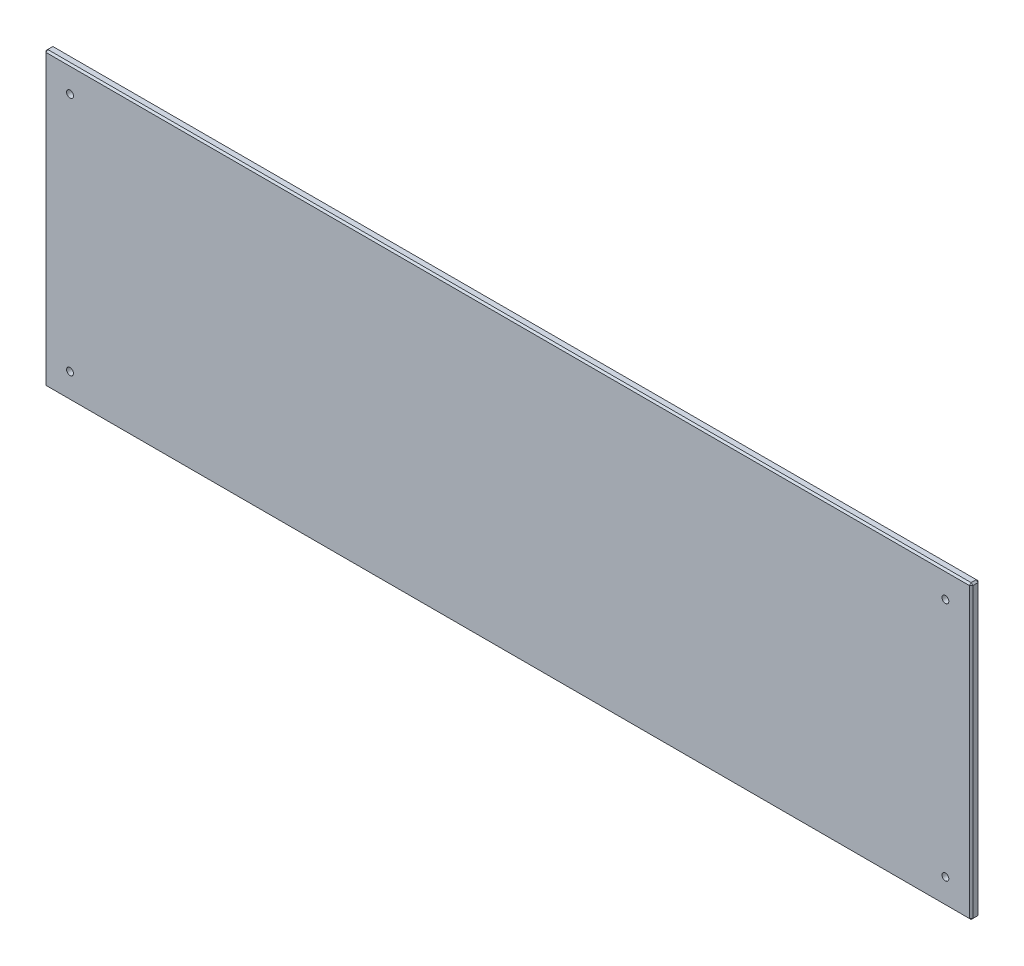
ISO-10303-21;
HEADER;
FILE_DESCRIPTION(('STEP AP214'),'2;1');
FILE_NAME('part.step','',(''),(''),'','','');
FILE_SCHEMA(('AUTOMOTIVE_DESIGN { 1 0 10303 214 1 1 1 1 }'));
ENDSEC;
DATA;
#1=APPLICATION_CONTEXT('core data for automotive mechanical design processes');
#2=APPLICATION_PROTOCOL_DEFINITION('international standard','automotive_design',2000,#1);
#3=PRODUCT_CONTEXT('',#1,'mechanical');
#4=PRODUCT('Part','Part','',(#3));
#5=PRODUCT_RELATED_PRODUCT_CATEGORY('part','',(#4));
#6=PRODUCT_DEFINITION_FORMATION('','',#4);
#7=PRODUCT_DEFINITION_CONTEXT('part definition',#1,'design');
#8=PRODUCT_DEFINITION('design','',#6,#7);
#9=PRODUCT_DEFINITION_SHAPE('','',#8);
#10=(LENGTH_UNIT() NAMED_UNIT(*) SI_UNIT(.MILLI.,.METRE.));
#11=(NAMED_UNIT(*) PLANE_ANGLE_UNIT() SI_UNIT($,.RADIAN.));
#12=(NAMED_UNIT(*) SI_UNIT($,.STERADIAN.) SOLID_ANGLE_UNIT());
#13=UNCERTAINTY_MEASURE_WITH_UNIT(LENGTH_MEASURE(1.E-05),#10,'distance_accuracy_value','');
#14=(GEOMETRIC_REPRESENTATION_CONTEXT(3) GLOBAL_UNCERTAINTY_ASSIGNED_CONTEXT((#13)) GLOBAL_UNIT_ASSIGNED_CONTEXT((#10,
#11,#12)) REPRESENTATION_CONTEXT('',''));
#15=CARTESIAN_POINT('',(0.,0.,0.));
#16=DIRECTION('',(0.,0.,1.));
#17=DIRECTION('',(1.,0.,0.));
#18=AXIS2_PLACEMENT_3D('',#15,#16,#17);
#19=CARTESIAN_POINT('',(0.,0.,5.));
#20=DIRECTION('',(1.,0.,0.));
#21=DIRECTION('',(0.,0.,-1.));
#22=AXIS2_PLACEMENT_3D('',#19,#20,#21);
#23=PLANE('',#22);
#24=DIRECTION('',(0.,0.,-1.));
#25=VECTOR('',#24,1.);
#26=CARTESIAN_POINT('',(0.,169.,5.));
#27=LINE('',#26,#25);
#28=CARTESIAN_POINT('',(0.,169.,4.));
#29=VERTEX_POINT('',#28);
#30=CARTESIAN_POINT('',(0.,169.,0.99999999999989));
#31=VERTEX_POINT('',#30);
#32=EDGE_CURVE('E220',#29,#31,#27,.T.);
#33=ORIENTED_EDGE('',*,*,#32,.T.);
#34=DIRECTION('',(0.,-1.,0.));
#35=VECTOR('',#34,1.);
#36=CARTESIAN_POINT('',(0.,0.,0.99999999999989));
#37=LINE('',#36,#35);
#38=CARTESIAN_POINT('',(0.,1.,0.99999999999989));
#39=VERTEX_POINT('',#38);
#40=EDGE_CURVE('E223',#31,#39,#37,.T.);
#41=ORIENTED_EDGE('',*,*,#40,.T.);
#42=DIRECTION('',(0.,0.,1.));
#43=VECTOR('',#42,1.);
#44=CARTESIAN_POINT('',(0.,1.,5.));
#45=LINE('',#44,#43);
#46=CARTESIAN_POINT('',(0.,1.,4.));
#47=VERTEX_POINT('',#46);
#48=EDGE_CURVE('E214',#39,#47,#45,.T.);
#49=ORIENTED_EDGE('',*,*,#48,.T.);
#50=DIRECTION('',(0.,1.,0.));
#51=VECTOR('',#50,1.);
#52=CARTESIAN_POINT('',(0.,0.,4.));
#53=LINE('',#52,#51);
#54=EDGE_CURVE('E217',#47,#29,#53,.T.);
#55=ORIENTED_EDGE('',*,*,#54,.T.);
#56=EDGE_LOOP('',(#33,#41,#49,#55));
#57=FACE_BOUND('',#56,.T.);
#58=ADVANCED_FACE('F41',(#57),#23,.F.);
#59=CARTESIAN_POINT('',(0.,0.,5.));
#60=DIRECTION('',(0.,1.,0.));
#61=DIRECTION('',(0.,0.,1.));
#62=AXIS2_PLACEMENT_3D('',#59,#60,#61);
#63=PLANE('',#62);
#64=DIRECTION('',(0.,0.,-1.));
#65=VECTOR('',#64,1.);
#66=CARTESIAN_POINT('',(0.99999999999989,0.,5.));
#67=LINE('',#66,#65);
#68=CARTESIAN_POINT('',(0.99999999999989,0.,4.));
#69=VERTEX_POINT('',#68);
#70=CARTESIAN_POINT('',(0.99999999999989,0.,0.99999999999989));
#71=VERTEX_POINT('',#70);
#72=EDGE_CURVE('E169',#69,#71,#67,.T.);
#73=ORIENTED_EDGE('',*,*,#72,.T.);
#74=DIRECTION('',(1.,0.,0.));
#75=VECTOR('',#74,1.);
#76=CARTESIAN_POINT('',(540.,0.,0.99999999999989));
#77=LINE('',#76,#75);
#78=CARTESIAN_POINT('',(539.,0.,0.99999999999989));
#79=VERTEX_POINT('',#78);
#80=EDGE_CURVE('E137',#71,#79,#77,.T.);
#81=ORIENTED_EDGE('',*,*,#80,.T.);
#82=DIRECTION('',(0.,0.,1.));
#83=VECTOR('',#82,1.);
#84=CARTESIAN_POINT('',(539.,0.,5.));
#85=LINE('',#84,#83);
#86=CARTESIAN_POINT('',(539.,0.,4.));
#87=VERTEX_POINT('',#86);
#88=EDGE_CURVE('E158',#79,#87,#85,.T.);
#89=ORIENTED_EDGE('',*,*,#88,.T.);
#90=DIRECTION('',(-1.,0.,0.));
#91=VECTOR('',#90,1.);
#92=CARTESIAN_POINT('',(0.,0.,4.));
#93=LINE('',#92,#91);
#94=EDGE_CURVE('E165',#87,#69,#93,.T.);
#95=ORIENTED_EDGE('',*,*,#94,.T.);
#96=EDGE_LOOP('',(#73,#81,#89,#95));
#97=FACE_BOUND('',#96,.T.);
#98=ADVANCED_FACE('F167',(#97),#63,.F.);
#99=CARTESIAN_POINT('',(540.,0.,5.));
#100=DIRECTION('',(-1.,0.,0.));
#101=DIRECTION('',(0.,0.,1.));
#102=AXIS2_PLACEMENT_3D('',#99,#100,#101);
#103=PLANE('',#102);
#104=DIRECTION('',(0.,0.,-1.));
#105=VECTOR('',#104,1.);
#106=CARTESIAN_POINT('',(540.,1.,5.));
#107=LINE('',#106,#105);
#108=CARTESIAN_POINT('',(540.,1.,4.));
#109=VERTEX_POINT('',#108);
#110=CARTESIAN_POINT('',(540.,1.,1.));
#111=VERTEX_POINT('',#110);
#112=EDGE_CURVE('E194',#109,#111,#107,.T.);
#113=ORIENTED_EDGE('',*,*,#112,.T.);
#114=DIRECTION('',(0.,1.,0.));
#115=VECTOR('',#114,1.);
#116=CARTESIAN_POINT('',(540.,170.,1.));
#117=LINE('',#116,#115);
#118=CARTESIAN_POINT('',(540.,169.,1.));
#119=VERTEX_POINT('',#118);
#120=EDGE_CURVE('E197',#111,#119,#117,.T.);
#121=ORIENTED_EDGE('',*,*,#120,.T.);
#122=DIRECTION('',(0.,0.,1.));
#123=VECTOR('',#122,1.);
#124=CARTESIAN_POINT('',(540.,169.,5.));
#125=LINE('',#124,#123);
#126=CARTESIAN_POINT('',(540.,169.,4.));
#127=VERTEX_POINT('',#126);
#128=EDGE_CURVE('E188',#119,#127,#125,.T.);
#129=ORIENTED_EDGE('',*,*,#128,.T.);
#130=DIRECTION('',(0.,-1.,0.));
#131=VECTOR('',#130,1.);
#132=CARTESIAN_POINT('',(540.,0.,4.));
#133=LINE('',#132,#131);
#134=EDGE_CURVE('E191',#127,#109,#133,.T.);
#135=ORIENTED_EDGE('',*,*,#134,.T.);
#136=EDGE_LOOP('',(#113,#121,#129,#135));
#137=FACE_BOUND('',#136,.T.);
#138=ADVANCED_FACE('F348',(#137),#103,.F.);
#139=CARTESIAN_POINT('',(0.,170.,5.));
#140=DIRECTION('',(0.,-1.,0.));
#141=DIRECTION('',(0.,0.,-1.));
#142=AXIS2_PLACEMENT_3D('',#139,#140,#141);
#143=PLANE('',#142);
#144=DIRECTION('',(-1.,0.,0.));
#145=VECTOR('',#144,1.);
#146=CARTESIAN_POINT('',(0.,170.,0.99999999999989));
#147=LINE('',#146,#145);
#148=CARTESIAN_POINT('',(539.,170.,0.99999999999989));
#149=VERTEX_POINT('',#148);
#150=CARTESIAN_POINT('',(0.99999999999989,170.,0.99999999999989));
#151=VERTEX_POINT('',#150);
#152=EDGE_CURVE('E207',#149,#151,#147,.T.);
#153=ORIENTED_EDGE('',*,*,#152,.T.);
#154=DIRECTION('',(0.,0.,1.));
#155=VECTOR('',#154,1.);
#156=CARTESIAN_POINT('',(0.99999999999989,170.,5.));
#157=LINE('',#156,#155);
#158=CARTESIAN_POINT('',(0.99999999999989,170.,4.00000000000011));
#159=VERTEX_POINT('',#158);
#160=EDGE_CURVE('E211',#151,#159,#157,.T.);
#161=ORIENTED_EDGE('',*,*,#160,.T.);
#162=DIRECTION('',(1.,0.,0.));
#163=VECTOR('',#162,1.);
#164=CARTESIAN_POINT('',(0.,170.,4.00000000000011));
#165=LINE('',#164,#163);
#166=CARTESIAN_POINT('',(539.,170.,4.00000000000011));
#167=VERTEX_POINT('',#166);
#168=EDGE_CURVE('E204',#159,#167,#165,.T.);
#169=ORIENTED_EDGE('',*,*,#168,.T.);
#170=DIRECTION('',(0.,0.,-1.));
#171=VECTOR('',#170,1.);
#172=CARTESIAN_POINT('',(539.,170.,5.));
#173=LINE('',#172,#171);
#174=EDGE_CURVE('E201',#167,#149,#173,.T.);
#175=ORIENTED_EDGE('',*,*,#174,.T.);
#176=EDGE_LOOP('',(#153,#161,#169,#175));
#177=FACE_BOUND('',#176,.T.);
#178=ADVANCED_FACE('F475',(#177),#143,.F.);
#179=CARTESIAN_POINT('',(0.,0.,5.));
#180=DIRECTION('',(0.,0.,-1.));
#181=DIRECTION('',(-1.,0.,0.));
#182=AXIS2_PLACEMENT_3D('',#179,#180,#181);
#183=PLANE('',#182);
#184=CARTESIAN_POINT('',(525.,15.,5.));
#185=DIRECTION('',(0.,0.,1.));
#186=DIRECTION('',(1.,0.,0.));
#187=AXIS2_PLACEMENT_3D('',#184,#185,#186);
#188=CIRCLE('',#187,2.);
#189=CARTESIAN_POINT('',(527.,15.,5.));
#190=VERTEX_POINT('',#189);
#191=EDGE_CURVE('E520',#190,#190,#188,.T.);
#192=ORIENTED_EDGE('',*,*,#191,.F.);
#193=EDGE_LOOP('',(#192));
#194=FACE_BOUND('',#193,.T.);
#195=CARTESIAN_POINT('',(15.,155.,5.));
#196=DIRECTION('',(0.,0.,1.));
#197=DIRECTION('',(1.,0.,0.));
#198=AXIS2_PLACEMENT_3D('',#195,#196,#197);
#199=CIRCLE('',#198,2.00000000000001);
#200=CARTESIAN_POINT('',(17.,155.,5.));
#201=VERTEX_POINT('',#200);
#202=EDGE_CURVE('E511',#201,#201,#199,.T.);
#203=ORIENTED_EDGE('',*,*,#202,.F.);
#204=EDGE_LOOP('',(#203));
#205=FACE_BOUND('',#204,.T.);
#206=CARTESIAN_POINT('',(15.,15.,5.));
#207=DIRECTION('',(0.,0.,1.));
#208=DIRECTION('',(1.,0.,0.));
#209=AXIS2_PLACEMENT_3D('',#206,#207,#208);
#210=CIRCLE('',#209,2.00000000000001);
#211=CARTESIAN_POINT('',(17.,15.,5.));
#212=VERTEX_POINT('',#211);
#213=EDGE_CURVE('E526',#212,#212,#210,.T.);
#214=ORIENTED_EDGE('',*,*,#213,.F.);
#215=EDGE_LOOP('',(#214));
#216=FACE_BOUND('',#215,.T.);
#217=CARTESIAN_POINT('',(525.,155.,5.));
#218=DIRECTION('',(0.,0.,1.));
#219=DIRECTION('',(1.,0.,0.));
#220=AXIS2_PLACEMENT_3D('',#217,#218,#219);
#221=CIRCLE('',#220,2.);
#222=CARTESIAN_POINT('',(527.,155.,5.));
#223=VERTEX_POINT('',#222);
#224=EDGE_CURVE('E503',#223,#223,#221,.T.);
#225=ORIENTED_EDGE('',*,*,#224,.F.);
#226=EDGE_LOOP('',(#225));
#227=FACE_BOUND('',#226,.T.);
#228=DIRECTION('',(0.,1.,0.));
#229=VECTOR('',#228,1.);
#230=CARTESIAN_POINT('',(539.,0.,5.));
#231=LINE('',#230,#229);
#232=CARTESIAN_POINT('',(539.,0.99999999999989,5.));
#233=VERTEX_POINT('',#232);
#234=CARTESIAN_POINT('',(539.,169.,5.));
#235=VERTEX_POINT('',#234);
#236=EDGE_CURVE('E227',#233,#235,#231,.T.);
#237=ORIENTED_EDGE('',*,*,#236,.T.);
#238=DIRECTION('',(-1.,0.,0.));
#239=VECTOR('',#238,1.);
#240=CARTESIAN_POINT('',(0.,169.,5.));
#241=LINE('',#240,#239);
#242=CARTESIAN_POINT('',(0.99999999999989,169.,5.));
#243=VERTEX_POINT('',#242);
#244=EDGE_CURVE('E11',#235,#243,#241,.T.);
#245=ORIENTED_EDGE('',*,*,#244,.T.);
#246=DIRECTION('',(0.,-1.,0.));
#247=VECTOR('',#246,1.);
#248=CARTESIAN_POINT('',(0.99999999999989,0.,5.));
#249=LINE('',#248,#247);
#250=CARTESIAN_POINT('',(0.99999999999989,0.99999999999989,5.));
#251=VERTEX_POINT('',#250);
#252=EDGE_CURVE('E52',#243,#251,#249,.T.);
#253=ORIENTED_EDGE('',*,*,#252,.T.);
#254=DIRECTION('',(1.,0.,0.));
#255=VECTOR('',#254,1.);
#256=CARTESIAN_POINT('',(0.,0.99999999999989,5.));
#257=LINE('',#256,#255);
#258=EDGE_CURVE('E230',#251,#233,#257,.T.);
#259=ORIENTED_EDGE('',*,*,#258,.T.);
#260=EDGE_LOOP('',(#237,#245,#253,#259));
#261=FACE_BOUND('',#260,.T.);
#262=ADVANCED_FACE('F469',(#194,#205,#216,#227,#261),#183,.F.);
#263=CARTESIAN_POINT('',(0.,0.,0.));
#264=DIRECTION('',(0.,0.,-1.));
#265=DIRECTION('',(-1.,0.,0.));
#266=AXIS2_PLACEMENT_3D('',#263,#264,#265);
#267=PLANE('',#266);
#268=CARTESIAN_POINT('',(525.,15.,0.));
#269=DIRECTION('',(0.,0.,1.));
#270=DIRECTION('',(1.,0.,0.));
#271=AXIS2_PLACEMENT_3D('',#268,#269,#270);
#272=CIRCLE('',#271,2.);
#273=CARTESIAN_POINT('',(527.,15.,0.));
#274=VERTEX_POINT('',#273);
#275=EDGE_CURVE('E507',#274,#274,#272,.T.);
#276=ORIENTED_EDGE('',*,*,#275,.T.);
#277=EDGE_LOOP('',(#276));
#278=FACE_BOUND('',#277,.T.);
#279=CARTESIAN_POINT('',(15.,155.,0.));
#280=DIRECTION('',(0.,0.,1.));
#281=DIRECTION('',(1.,0.,0.));
#282=AXIS2_PLACEMENT_3D('',#279,#280,#281);
#283=CIRCLE('',#282,2.00000000000001);
#284=CARTESIAN_POINT('',(17.,155.,0.));
#285=VERTEX_POINT('',#284);
#286=EDGE_CURVE('E515',#285,#285,#283,.T.);
#287=ORIENTED_EDGE('',*,*,#286,.T.);
#288=EDGE_LOOP('',(#287));
#289=FACE_BOUND('',#288,.T.);
#290=CARTESIAN_POINT('',(15.,15.,0.));
#291=DIRECTION('',(0.,0.,1.));
#292=DIRECTION('',(1.,0.,0.));
#293=AXIS2_PLACEMENT_3D('',#290,#291,#292);
#294=CIRCLE('',#293,2.00000000000001);
#295=CARTESIAN_POINT('',(17.,15.,0.));
#296=VERTEX_POINT('',#295);
#297=EDGE_CURVE('E516',#296,#296,#294,.T.);
#298=ORIENTED_EDGE('',*,*,#297,.T.);
#299=EDGE_LOOP('',(#298));
#300=FACE_BOUND('',#299,.T.);
#301=CARTESIAN_POINT('',(525.,155.,0.));
#302=DIRECTION('',(0.,0.,1.));
#303=DIRECTION('',(1.,0.,0.));
#304=AXIS2_PLACEMENT_3D('',#301,#302,#303);
#305=CIRCLE('',#304,2.);
#306=CARTESIAN_POINT('',(527.,155.,0.));
#307=VERTEX_POINT('',#306);
#308=EDGE_CURVE('E144',#307,#307,#305,.T.);
#309=ORIENTED_EDGE('',*,*,#308,.T.);
#310=EDGE_LOOP('',(#309));
#311=FACE_BOUND('',#310,.T.);
#312=DIRECTION('',(0.,-1.,0.));
#313=VECTOR('',#312,1.);
#314=CARTESIAN_POINT('',(539.,0.,0.));
#315=LINE('',#314,#313);
#316=CARTESIAN_POINT('',(539.,169.,0.));
#317=VERTEX_POINT('',#316);
#318=CARTESIAN_POINT('',(539.,1.,0.));
#319=VERTEX_POINT('',#318);
#320=EDGE_CURVE('E183',#317,#319,#315,.T.);
#321=ORIENTED_EDGE('',*,*,#320,.T.);
#322=DIRECTION('',(-1.,0.,0.));
#323=VECTOR('',#322,1.);
#324=CARTESIAN_POINT('',(0.,1.,0.));
#325=LINE('',#324,#323);
#326=CARTESIAN_POINT('',(1.,1.,0.));
#327=VERTEX_POINT('',#326);
#328=EDGE_CURVE('E139',#319,#327,#325,.T.);
#329=ORIENTED_EDGE('',*,*,#328,.T.);
#330=DIRECTION('',(0.,1.,0.));
#331=VECTOR('',#330,1.);
#332=CARTESIAN_POINT('',(1.,170.,0.));
#333=LINE('',#332,#331);
#334=CARTESIAN_POINT('',(1.,169.,0.));
#335=VERTEX_POINT('',#334);
#336=EDGE_CURVE('E172',#327,#335,#333,.T.);
#337=ORIENTED_EDGE('',*,*,#336,.T.);
#338=DIRECTION('',(1.,0.,0.));
#339=VECTOR('',#338,1.);
#340=CARTESIAN_POINT('',(540.,169.,0.));
#341=LINE('',#340,#339);
#342=EDGE_CURVE('E176',#335,#317,#341,.T.);
#343=ORIENTED_EDGE('',*,*,#342,.T.);
#344=EDGE_LOOP('',(#321,#329,#337,#343));
#345=FACE_BOUND('',#344,.T.);
#346=ADVANCED_FACE('F465',(#278,#289,#300,#311,#345),#267,.T.);
#347=CARTESIAN_POINT('',(0.,169.,5.));
#348=DIRECTION('',(0.,-0.707106781186508,-0.707106781186587));
#349=DIRECTION('',(-1.,0.,0.));
#350=AXIS2_PLACEMENT_3D('',#347,#348,#349);
#351=PLANE('',#350);
#352=DIRECTION('',(0.,-0.707106781186587,0.707106781186508));
#353=VECTOR('',#352,1.);
#354=CARTESIAN_POINT('',(0.99999999999989,169.,5.));
#355=LINE('',#354,#353);
#356=EDGE_CURVE('E46',#243,#159,#355,.F.);
#357=ORIENTED_EDGE('',*,*,#356,.F.);
#358=ORIENTED_EDGE('',*,*,#244,.F.);
#359=DIRECTION('',(0.,0.707106781186587,-0.707106781186508));
#360=VECTOR('',#359,1.);
#361=CARTESIAN_POINT('',(539.,170.,4.00000000000011));
#362=LINE('',#361,#360);
#363=EDGE_CURVE('E303',#167,#235,#362,.F.);
#364=ORIENTED_EDGE('',*,*,#363,.F.);
#365=ORIENTED_EDGE('',*,*,#168,.F.);
#366=EDGE_LOOP('',(#357,#358,#364,#365));
#367=FACE_BOUND('',#366,.T.);
#368=ADVANCED_FACE('F44',(#367),#351,.F.);
#369=CARTESIAN_POINT('',(0.99999999999989,169.,5.));
#370=DIRECTION('',(-0.57735026918969,0.577350269189562,0.577350269189626));
#371=DIRECTION('',(0.707106781186508,0.,0.707106781186587));
#372=AXIS2_PLACEMENT_3D('',#369,#370,#371);
#373=PLANE('',#372);
#374=DIRECTION('',(-0.707106781186508,0.,-0.707106781186587));
#375=VECTOR('',#374,1.);
#376=CARTESIAN_POINT('',(0.99999999999989,169.,5.));
#377=LINE('',#376,#375);
#378=EDGE_CURVE('E297',#243,#29,#377,.T.);
#379=ORIENTED_EDGE('',*,*,#378,.F.);
#380=ORIENTED_EDGE('',*,*,#356,.T.);
#381=DIRECTION('',(0.707106781186508,0.707106781186587,0.));
#382=VECTOR('',#381,1.);
#383=CARTESIAN_POINT('',(0.499999999999945,169.5,4.00000000000006));
#384=LINE('',#383,#382);
#385=EDGE_CURVE('E300',#29,#159,#384,.T.);
#386=ORIENTED_EDGE('',*,*,#385,.F.);
#387=EDGE_LOOP('',(#379,#380,#386));
#388=FACE_BOUND('',#387,.T.);
#389=ADVANCED_FACE('F315',(#388),#373,.T.);
#390=CARTESIAN_POINT('',(539.,170.,4.00000000000011));
#391=DIRECTION('',(0.57735026918969,0.577350269189562,0.577350269189626));
#392=DIRECTION('',(0.707106781186508,0.,-0.707106781186587));
#393=AXIS2_PLACEMENT_3D('',#390,#391,#392);
#394=PLANE('',#393);
#395=DIRECTION('',(0.707106781186508,-0.707106781186587,0.));
#396=VECTOR('',#395,1.);
#397=CARTESIAN_POINT('',(539.,170.,4.00000000000011));
#398=LINE('',#397,#396);
#399=EDGE_CURVE('E289',#167,#127,#398,.T.);
#400=ORIENTED_EDGE('',*,*,#399,.F.);
#401=ORIENTED_EDGE('',*,*,#363,.T.);
#402=DIRECTION('',(-0.707106781186508,0.,0.707106781186587));
#403=VECTOR('',#402,1.);
#404=CARTESIAN_POINT('',(539.5,169.,4.5));
#405=LINE('',#404,#403);
#406=EDGE_CURVE('E293',#127,#235,#405,.T.);
#407=ORIENTED_EDGE('',*,*,#406,.F.);
#408=EDGE_LOOP('',(#400,#401,#407));
#409=FACE_BOUND('',#408,.T.);
#410=ADVANCED_FACE('F340',(#409),#394,.T.);
#411=CARTESIAN_POINT('',(0.,169.,5.));
#412=DIRECTION('',(0.707106781186587,-0.707106781186508,0.));
#413=DIRECTION('',(0.,0.,-1.));
#414=AXIS2_PLACEMENT_3D('',#411,#412,#413);
#415=PLANE('',#414);
#416=ORIENTED_EDGE('',*,*,#385,.T.);
#417=ORIENTED_EDGE('',*,*,#160,.F.);
#418=DIRECTION('',(-0.707106781186508,-0.707106781186587,0.));
#419=VECTOR('',#418,1.);
#420=CARTESIAN_POINT('',(0.99999999999989,170.,0.99999999999989));
#421=LINE('',#420,#419);
#422=EDGE_CURVE('E282',#31,#151,#421,.F.);
#423=ORIENTED_EDGE('',*,*,#422,.F.);
#424=ORIENTED_EDGE('',*,*,#32,.F.);
#425=EDGE_LOOP('',(#416,#417,#423,#424));
#426=FACE_BOUND('',#425,.T.);
#427=ADVANCED_FACE('F322',(#426),#415,.F.);
#428=CARTESIAN_POINT('',(0.99999999999989,0.,5.));
#429=DIRECTION('',(0.707106781186587,0.,-0.707106781186508));
#430=DIRECTION('',(0.,-1.,0.));
#431=AXIS2_PLACEMENT_3D('',#428,#429,#430);
#432=PLANE('',#431);
#433=ORIENTED_EDGE('',*,*,#378,.T.);
#434=ORIENTED_EDGE('',*,*,#54,.F.);
#435=DIRECTION('',(0.707106781186508,0.,0.707106781186587));
#436=VECTOR('',#435,1.);
#437=CARTESIAN_POINT('',(0.99999999999989,0.99999999999989,5.));
#438=LINE('',#437,#436);
#439=EDGE_CURVE('E278',#251,#47,#438,.F.);
#440=ORIENTED_EDGE('',*,*,#439,.F.);
#441=ORIENTED_EDGE('',*,*,#252,.F.);
#442=EDGE_LOOP('',(#433,#434,#440,#441));
#443=FACE_BOUND('',#442,.T.);
#444=ADVANCED_FACE('F329',(#443),#432,.F.);
#445=CARTESIAN_POINT('',(0.,0.99999999999989,5.));
#446=DIRECTION('',(0.,0.707106781186587,-0.707106781186508));
#447=DIRECTION('',(1.,0.,0.));
#448=AXIS2_PLACEMENT_3D('',#445,#446,#447);
#449=PLANE('',#448);
#450=DIRECTION('',(0.,0.707106781186508,0.707106781186587));
#451=VECTOR('',#450,1.);
#452=CARTESIAN_POINT('',(539.,0.99999999999989,5.));
#453=LINE('',#452,#451);
#454=EDGE_CURVE('E270',#233,#87,#453,.F.);
#455=ORIENTED_EDGE('',*,*,#454,.F.);
#456=ORIENTED_EDGE('',*,*,#258,.F.);
#457=DIRECTION('',(0.,-0.707106781186508,-0.707106781186587));
#458=VECTOR('',#457,1.);
#459=CARTESIAN_POINT('',(0.99999999999989,0.99999999999989,5.));
#460=LINE('',#459,#458);
#461=EDGE_CURVE('E274',#69,#251,#460,.F.);
#462=ORIENTED_EDGE('',*,*,#461,.F.);
#463=ORIENTED_EDGE('',*,*,#94,.F.);
#464=EDGE_LOOP('',(#455,#456,#462,#463));
#465=FACE_BOUND('',#464,.T.);
#466=ADVANCED_FACE('F331',(#465),#449,.F.);
#467=CARTESIAN_POINT('',(539.,0.,5.));
#468=DIRECTION('',(-0.707106781186587,0.,-0.707106781186508));
#469=DIRECTION('',(0.,1.,0.));
#470=AXIS2_PLACEMENT_3D('',#467,#468,#469);
#471=PLANE('',#470);
#472=ORIENTED_EDGE('',*,*,#406,.T.);
#473=ORIENTED_EDGE('',*,*,#236,.F.);
#474=DIRECTION('',(0.707106781186508,0.,-0.707106781186587));
#475=VECTOR('',#474,1.);
#476=CARTESIAN_POINT('',(539.,0.99999999999989,5.));
#477=LINE('',#476,#475);
#478=EDGE_CURVE('E266',#109,#233,#477,.F.);
#479=ORIENTED_EDGE('',*,*,#478,.F.);
#480=ORIENTED_EDGE('',*,*,#134,.F.);
#481=EDGE_LOOP('',(#472,#473,#479,#480));
#482=FACE_BOUND('',#481,.T.);
#483=ADVANCED_FACE('F337',(#482),#471,.F.);
#484=CARTESIAN_POINT('',(539.,170.,5.));
#485=DIRECTION('',(-0.707106781186587,-0.707106781186508,0.));
#486=DIRECTION('',(0.,0.,-1.));
#487=AXIS2_PLACEMENT_3D('',#484,#485,#486);
#488=PLANE('',#487);
#489=ORIENTED_EDGE('',*,*,#399,.T.);
#490=ORIENTED_EDGE('',*,*,#128,.F.);
#491=DIRECTION('',(-0.707106781186508,0.707106781186587,0.));
#492=VECTOR('',#491,1.);
#493=CARTESIAN_POINT('',(540.,169.,1.));
#494=LINE('',#493,#492);
#495=EDGE_CURVE('E262',#149,#119,#494,.F.);
#496=ORIENTED_EDGE('',*,*,#495,.F.);
#497=ORIENTED_EDGE('',*,*,#174,.F.);
#498=EDGE_LOOP('',(#489,#490,#496,#497));
#499=FACE_BOUND('',#498,.T.);
#500=ADVANCED_FACE('F431',(#499),#488,.F.);
#501=CARTESIAN_POINT('',(0.,170.,0.99999999999989));
#502=DIRECTION('',(0.,0.707106781186508,-0.707106781186587));
#503=DIRECTION('',(1.,0.,0.));
#504=AXIS2_PLACEMENT_3D('',#501,#502,#503);
#505=PLANE('',#504);
#506=DIRECTION('',(0.,-0.707106781186587,-0.707106781186508));
#507=VECTOR('',#506,1.);
#508=CARTESIAN_POINT('',(0.99999999999989,170.,0.99999999999989));
#509=LINE('',#508,#507);
#510=EDGE_CURVE('E285',#151,#335,#509,.T.);
#511=ORIENTED_EDGE('',*,*,#510,.F.);
#512=ORIENTED_EDGE('',*,*,#152,.F.);
#513=DIRECTION('',(0.,0.707106781186587,0.707106781186508));
#514=VECTOR('',#513,1.);
#515=CARTESIAN_POINT('',(539.,169.5,0.499999999999945));
#516=LINE('',#515,#514);
#517=EDGE_CURVE('E258',#317,#149,#516,.T.);
#518=ORIENTED_EDGE('',*,*,#517,.F.);
#519=ORIENTED_EDGE('',*,*,#342,.F.);
#520=EDGE_LOOP('',(#511,#512,#518,#519));
#521=FACE_BOUND('',#520,.T.);
#522=ADVANCED_FACE('F424',(#521),#505,.T.);
#523=CARTESIAN_POINT('',(0.99999999999989,170.,0.99999999999989));
#524=DIRECTION('',(-0.577350269189626,0.577350269189562,-0.57735026918969));
#525=DIRECTION('',(-0.707106781186587,0.,0.707106781186508));
#526=AXIS2_PLACEMENT_3D('',#523,#524,#525);
#527=PLANE('',#526);
#528=ORIENTED_EDGE('',*,*,#422,.T.);
#529=ORIENTED_EDGE('',*,*,#510,.T.);
#530=DIRECTION('',(-0.707106781186587,0.,0.707106781186508));
#531=VECTOR('',#530,1.);
#532=CARTESIAN_POINT('',(0.5,169.,0.499999999999945));
#533=LINE('',#532,#531);
#534=EDGE_CURVE('E254',#31,#335,#533,.F.);
#535=ORIENTED_EDGE('',*,*,#534,.F.);
#536=EDGE_LOOP('',(#528,#529,#535));
#537=FACE_BOUND('',#536,.T.);
#538=ADVANCED_FACE('F417',(#537),#527,.T.);
#539=CARTESIAN_POINT('',(0.99999999999989,0.99999999999989,5.));
#540=DIRECTION('',(-0.57735026918969,-0.577350269189626,0.577350269189562));
#541=DIRECTION('',(0.707106781186508,-0.707106781186587,0.));
#542=AXIS2_PLACEMENT_3D('',#539,#540,#541);
#543=PLANE('',#542);
#544=ORIENTED_EDGE('',*,*,#461,.T.);
#545=ORIENTED_EDGE('',*,*,#439,.T.);
#546=DIRECTION('',(-0.707106781186508,0.707106781186587,0.));
#547=VECTOR('',#546,1.);
#548=CARTESIAN_POINT('',(0.499999999999945,0.5,4.));
#549=LINE('',#548,#547);
#550=EDGE_CURVE('E250',#69,#47,#549,.T.);
#551=ORIENTED_EDGE('',*,*,#550,.F.);
#552=EDGE_LOOP('',(#544,#545,#551));
#553=FACE_BOUND('',#552,.T.);
#554=ADVANCED_FACE('F410',(#553),#543,.T.);
#555=CARTESIAN_POINT('',(539.,0.99999999999989,5.));
#556=DIRECTION('',(0.57735026918969,-0.577350269189626,0.577350269189562));
#557=DIRECTION('',(0.707106781186508,0.707106781186587,0.));
#558=AXIS2_PLACEMENT_3D('',#555,#556,#557);
#559=PLANE('',#558);
#560=ORIENTED_EDGE('',*,*,#478,.T.);
#561=ORIENTED_EDGE('',*,*,#454,.T.);
#562=DIRECTION('',(-0.707106781186508,-0.707106781186587,0.));
#563=VECTOR('',#562,1.);
#564=CARTESIAN_POINT('',(539.5,0.500000000000001,4.));
#565=LINE('',#564,#563);
#566=EDGE_CURVE('E161',#109,#87,#565,.T.);
#567=ORIENTED_EDGE('',*,*,#566,.F.);
#568=EDGE_LOOP('',(#560,#561,#567));
#569=FACE_BOUND('',#568,.T.);
#570=ADVANCED_FACE('F403',(#569),#559,.T.);
#571=CARTESIAN_POINT('',(540.,169.,1.));
#572=DIRECTION('',(0.57735026918969,0.577350269189562,-0.577350269189626));
#573=DIRECTION('',(-0.707106781186508,0.,-0.707106781186587));
#574=AXIS2_PLACEMENT_3D('',#571,#572,#573);
#575=PLANE('',#574);
#576=ORIENTED_EDGE('',*,*,#517,.T.);
#577=ORIENTED_EDGE('',*,*,#495,.T.);
#578=DIRECTION('',(-0.707106781186508,0.,-0.707106781186587));
#579=VECTOR('',#578,1.);
#580=CARTESIAN_POINT('',(540.,169.,1.));
#581=LINE('',#580,#579);
#582=EDGE_CURVE('E245',#317,#119,#581,.F.);
#583=ORIENTED_EDGE('',*,*,#582,.F.);
#584=EDGE_LOOP('',(#576,#577,#583));
#585=FACE_BOUND('',#584,.T.);
#586=ADVANCED_FACE('F396',(#585),#575,.T.);
#587=CARTESIAN_POINT('',(0.,0.,0.99999999999989));
#588=DIRECTION('',(-0.707106781186508,0.,-0.707106781186587));
#589=DIRECTION('',(0.,1.,0.));
#590=AXIS2_PLACEMENT_3D('',#587,#588,#589);
#591=PLANE('',#590);
#592=ORIENTED_EDGE('',*,*,#534,.T.);
#593=ORIENTED_EDGE('',*,*,#336,.F.);
#594=DIRECTION('',(0.707106781186587,0.,-0.707106781186508));
#595=VECTOR('',#594,1.);
#596=CARTESIAN_POINT('',(1.,1.,0.));
#597=LINE('',#596,#595);
#598=EDGE_CURVE('E241',#39,#327,#597,.T.);
#599=ORIENTED_EDGE('',*,*,#598,.F.);
#600=ORIENTED_EDGE('',*,*,#40,.F.);
#601=EDGE_LOOP('',(#592,#593,#599,#600));
#602=FACE_BOUND('',#601,.T.);
#603=ADVANCED_FACE('F389',(#602),#591,.T.);
#604=CARTESIAN_POINT('',(0.99999999999989,0.,5.));
#605=DIRECTION('',(0.707106781186587,0.707106781186508,0.));
#606=DIRECTION('',(0.,0.,-1.));
#607=AXIS2_PLACEMENT_3D('',#604,#605,#606);
#608=PLANE('',#607);
#609=ORIENTED_EDGE('',*,*,#550,.T.);
#610=ORIENTED_EDGE('',*,*,#48,.F.);
#611=DIRECTION('',(0.707106781186508,-0.707106781186587,0.));
#612=VECTOR('',#611,1.);
#613=CARTESIAN_POINT('',(0.499999999999945,0.500000000000001,0.99999999999989));
#614=LINE('',#613,#612);
#615=EDGE_CURVE('E155',#71,#39,#614,.F.);
#616=ORIENTED_EDGE('',*,*,#615,.F.);
#617=ORIENTED_EDGE('',*,*,#72,.F.);
#618=EDGE_LOOP('',(#609,#610,#616,#617));
#619=FACE_BOUND('',#618,.T.);
#620=ADVANCED_FACE('F383',(#619),#608,.F.);
#621=CARTESIAN_POINT('',(540.,1.,5.));
#622=DIRECTION('',(-0.707106781186587,0.707106781186508,0.));
#623=DIRECTION('',(0.,0.,-1.));
#624=AXIS2_PLACEMENT_3D('',#621,#622,#623);
#625=PLANE('',#624);
#626=ORIENTED_EDGE('',*,*,#566,.T.);
#627=ORIENTED_EDGE('',*,*,#88,.F.);
#628=DIRECTION('',(0.707106781186508,0.707106781186587,0.));
#629=VECTOR('',#628,1.);
#630=CARTESIAN_POINT('',(539.,0.,0.99999999999989));
#631=LINE('',#630,#629);
#632=EDGE_CURVE('E147',#111,#79,#631,.F.);
#633=ORIENTED_EDGE('',*,*,#632,.F.);
#634=ORIENTED_EDGE('',*,*,#112,.F.);
#635=EDGE_LOOP('',(#626,#627,#633,#634));
#636=FACE_BOUND('',#635,.T.);
#637=ADVANCED_FACE('F159',(#636),#625,.F.);
#638=CARTESIAN_POINT('',(540.,0.,1.));
#639=DIRECTION('',(0.707106781186587,0.,-0.707106781186508));
#640=DIRECTION('',(0.,-1.,0.));
#641=AXIS2_PLACEMENT_3D('',#638,#639,#640);
#642=PLANE('',#641);
#643=ORIENTED_EDGE('',*,*,#582,.T.);
#644=ORIENTED_EDGE('',*,*,#120,.F.);
#645=DIRECTION('',(0.707106781186508,0.,0.707106781186587));
#646=VECTOR('',#645,1.);
#647=CARTESIAN_POINT('',(539.5,1.,0.500000000000001));
#648=LINE('',#647,#646);
#649=EDGE_CURVE('E151',#319,#111,#648,.T.);
#650=ORIENTED_EDGE('',*,*,#649,.F.);
#651=ORIENTED_EDGE('',*,*,#320,.F.);
#652=EDGE_LOOP('',(#643,#644,#650,#651));
#653=FACE_BOUND('',#652,.T.);
#654=ADVANCED_FACE('F370',(#653),#642,.T.);
#655=CARTESIAN_POINT('',(1.,1.,0.));
#656=DIRECTION('',(-0.577350269189626,-0.577350269189562,-0.57735026918969));
#657=DIRECTION('',(-0.707106781186587,0.,0.707106781186508));
#658=AXIS2_PLACEMENT_3D('',#655,#656,#657);
#659=PLANE('',#658);
#660=ORIENTED_EDGE('',*,*,#615,.T.);
#661=ORIENTED_EDGE('',*,*,#598,.T.);
#662=DIRECTION('',(0.,-0.707106781186587,0.707106781186508));
#663=VECTOR('',#662,1.);
#664=CARTESIAN_POINT('',(1.,1.,0.));
#665=LINE('',#664,#663);
#666=EDGE_CURVE('E143',#71,#327,#665,.F.);
#667=ORIENTED_EDGE('',*,*,#666,.F.);
#668=EDGE_LOOP('',(#660,#661,#667));
#669=FACE_BOUND('',#668,.T.);
#670=ADVANCED_FACE('F364',(#669),#659,.T.);
#671=CARTESIAN_POINT('',(539.,0.,0.99999999999989));
#672=DIRECTION('',(0.57735026918969,-0.577350269189562,-0.577350269189626));
#673=DIRECTION('',(-0.707106781186508,0.,-0.707106781186587));
#674=AXIS2_PLACEMENT_3D('',#671,#672,#673);
#675=PLANE('',#674);
#676=ORIENTED_EDGE('',*,*,#649,.T.);
#677=ORIENTED_EDGE('',*,*,#632,.T.);
#678=DIRECTION('',(0.,0.707106781186587,-0.707106781186508));
#679=VECTOR('',#678,1.);
#680=CARTESIAN_POINT('',(539.,0.,0.99999999999989));
#681=LINE('',#680,#679);
#682=EDGE_CURVE('E133',#319,#79,#681,.F.);
#683=ORIENTED_EDGE('',*,*,#682,.F.);
#684=EDGE_LOOP('',(#676,#677,#683));
#685=FACE_BOUND('',#684,.T.);
#686=ADVANCED_FACE('F149',(#685),#675,.T.);
#687=CARTESIAN_POINT('',(0.,0.,0.99999999999989));
#688=DIRECTION('',(0.,-0.707106781186508,-0.707106781186587));
#689=DIRECTION('',(-1.,0.,0.));
#690=AXIS2_PLACEMENT_3D('',#687,#688,#689);
#691=PLANE('',#690);
#692=ORIENTED_EDGE('',*,*,#666,.T.);
#693=ORIENTED_EDGE('',*,*,#328,.F.);
#694=ORIENTED_EDGE('',*,*,#682,.T.);
#695=ORIENTED_EDGE('',*,*,#80,.F.);
#696=EDGE_LOOP('',(#692,#693,#694,#695));
#697=FACE_BOUND('',#696,.T.);
#698=ADVANCED_FACE('F135',(#697),#691,.T.);
#699=CARTESIAN_POINT('',(525.,155.,0.));
#700=DIRECTION('',(0.,0.,1.));
#701=DIRECTION('',(1.,0.,0.));
#702=AXIS2_PLACEMENT_3D('',#699,#700,#701);
#703=CYLINDRICAL_SURFACE('',#702,2.);
#704=ORIENTED_EDGE('',*,*,#308,.F.);
#705=EDGE_LOOP('',(#704));
#706=FACE_BOUND('',#705,.T.);
#707=ORIENTED_EDGE('',*,*,#224,.T.);
#708=EDGE_LOOP('',(#707));
#709=FACE_BOUND('',#708,.T.);
#710=ADVANCED_FACE('F358',(#706,#709),#703,.F.);
#711=CARTESIAN_POINT('',(15.,15.,0.));
#712=DIRECTION('',(0.,0.,1.));
#713=DIRECTION('',(1.,0.,0.));
#714=AXIS2_PLACEMENT_3D('',#711,#712,#713);
#715=CYLINDRICAL_SURFACE('',#714,2.00000000000001);
#716=ORIENTED_EDGE('',*,*,#297,.F.);
#717=EDGE_LOOP('',(#716));
#718=FACE_BOUND('',#717,.T.);
#719=ORIENTED_EDGE('',*,*,#213,.T.);
#720=EDGE_LOOP('',(#719));
#721=FACE_BOUND('',#720,.T.);
#722=ADVANCED_FACE('F536',(#718,#721),#715,.F.);
#723=CARTESIAN_POINT('',(15.,155.,0.));
#724=DIRECTION('',(0.,0.,1.));
#725=DIRECTION('',(1.,0.,0.));
#726=AXIS2_PLACEMENT_3D('',#723,#724,#725);
#727=CYLINDRICAL_SURFACE('',#726,2.00000000000001);
#728=ORIENTED_EDGE('',*,*,#286,.F.);
#729=EDGE_LOOP('',(#728));
#730=FACE_BOUND('',#729,.T.);
#731=ORIENTED_EDGE('',*,*,#202,.T.);
#732=EDGE_LOOP('',(#731));
#733=FACE_BOUND('',#732,.T.);
#734=ADVANCED_FACE('F539',(#730,#733),#727,.F.);
#735=CARTESIAN_POINT('',(525.,15.,0.));
#736=DIRECTION('',(0.,0.,1.));
#737=DIRECTION('',(1.,0.,0.));
#738=AXIS2_PLACEMENT_3D('',#735,#736,#737);
#739=CYLINDRICAL_SURFACE('',#738,2.);
#740=ORIENTED_EDGE('',*,*,#275,.F.);
#741=EDGE_LOOP('',(#740));
#742=FACE_BOUND('',#741,.T.);
#743=ORIENTED_EDGE('',*,*,#191,.T.);
#744=EDGE_LOOP('',(#743));
#745=FACE_BOUND('',#744,.T.);
#746=ADVANCED_FACE('F561',(#742,#745),#739,.F.);
#747=CLOSED_SHELL('',(#58,#98,#138,#178,#262,#346,#368,#389,#410,#427,#444,#466,#483,#500,#522,
#538,#554,#570,#586,#603,#620,#637,#654,#670,#686,#698,#710,#722,#734,#746));
#748=MANIFOLD_SOLID_BREP('B2',#747);
#749=ADVANCED_BREP_SHAPE_REPRESENTATION('',(#18,#748),#14);
#750=SHAPE_DEFINITION_REPRESENTATION(#9,#749);
ENDSEC;
END-ISO-10303-21;
